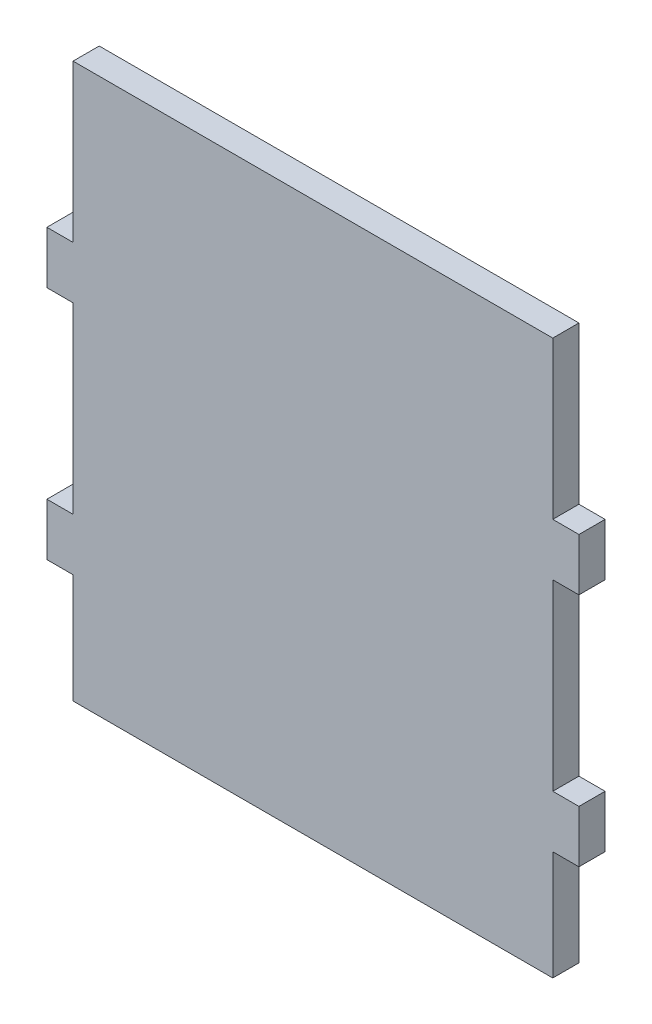
ISO-10303-21;
HEADER;
FILE_DESCRIPTION(('STEP AP214'),'2;1');
FILE_NAME('part.step','',(''),(''),'','','');
FILE_SCHEMA(('AUTOMOTIVE_DESIGN { 1 0 10303 214 1 1 1 1 }'));
ENDSEC;
DATA;
#1=APPLICATION_CONTEXT('core data for automotive mechanical design processes');
#2=APPLICATION_PROTOCOL_DEFINITION('international standard','automotive_design',2000,#1);
#3=PRODUCT_CONTEXT('',#1,'mechanical');
#4=PRODUCT('Part','Part','',(#3));
#5=PRODUCT_RELATED_PRODUCT_CATEGORY('part','',(#4));
#6=PRODUCT_DEFINITION_FORMATION('','',#4);
#7=PRODUCT_DEFINITION_CONTEXT('part definition',#1,'design');
#8=PRODUCT_DEFINITION('design','',#6,#7);
#9=PRODUCT_DEFINITION_SHAPE('','',#8);
#10=(LENGTH_UNIT() NAMED_UNIT(*) SI_UNIT(.MILLI.,.METRE.));
#11=(NAMED_UNIT(*) PLANE_ANGLE_UNIT() SI_UNIT($,.RADIAN.));
#12=(NAMED_UNIT(*) SI_UNIT($,.STERADIAN.) SOLID_ANGLE_UNIT());
#13=UNCERTAINTY_MEASURE_WITH_UNIT(LENGTH_MEASURE(1.E-05),#10,'distance_accuracy_value','');
#14=(GEOMETRIC_REPRESENTATION_CONTEXT(3) GLOBAL_UNCERTAINTY_ASSIGNED_CONTEXT((#13)) GLOBAL_UNIT_ASSIGNED_CONTEXT((#10,
#11,#12)) REPRESENTATION_CONTEXT('',''));
#15=CARTESIAN_POINT('',(0.,0.,0.));
#16=DIRECTION('',(0.,0.,1.));
#17=DIRECTION('',(1.,0.,0.));
#18=AXIS2_PLACEMENT_3D('',#15,#16,#17);
#19=CARTESIAN_POINT('',(0.,-18.,3.));
#20=DIRECTION('',(0.,-1.,0.));
#21=DIRECTION('',(1.,0.,0.));
#22=AXIS2_PLACEMENT_3D('',#19,#20,#21);
#23=PLANE('',#22);
#24=DIRECTION('',(-1.,0.,0.));
#25=VECTOR('',#24,1.);
#26=CARTESIAN_POINT('',(0.,-18.,0.));
#27=LINE('',#26,#25);
#28=CARTESIAN_POINT('',(0.,-18.,0.));
#29=VERTEX_POINT('',#28);
#30=CARTESIAN_POINT('',(-3.,-18.,0.));
#31=VERTEX_POINT('',#30);
#32=EDGE_CURVE('E207',#29,#31,#27,.T.);
#33=ORIENTED_EDGE('',*,*,#32,.T.);
#34=DIRECTION('',(0.,0.,-1.));
#35=VECTOR('',#34,1.);
#36=CARTESIAN_POINT('',(-3.,-18.,3.));
#37=LINE('',#36,#35);
#38=CARTESIAN_POINT('',(-3.,-18.,3.));
#39=VERTEX_POINT('',#38);
#40=EDGE_CURVE('E11',#39,#31,#37,.T.);
#41=ORIENTED_EDGE('',*,*,#40,.F.);
#42=DIRECTION('',(-1.,0.,0.));
#43=VECTOR('',#42,1.);
#44=CARTESIAN_POINT('',(0.,-18.,3.));
#45=LINE('',#44,#43);
#46=CARTESIAN_POINT('',(0.,-18.,3.));
#47=VERTEX_POINT('',#46);
#48=EDGE_CURVE('E245',#47,#39,#45,.T.);
#49=ORIENTED_EDGE('',*,*,#48,.F.);
#50=DIRECTION('',(0.,0.,-1.));
#51=VECTOR('',#50,1.);
#52=CARTESIAN_POINT('',(0.,-18.,3.));
#53=LINE('',#52,#51);
#54=EDGE_CURVE('E203',#47,#29,#53,.T.);
#55=ORIENTED_EDGE('',*,*,#54,.T.);
#56=EDGE_LOOP('',(#33,#41,#49,#55));
#57=FACE_BOUND('',#56,.T.);
#58=ADVANCED_FACE('F39',(#57),#23,.F.);
#59=CARTESIAN_POINT('',(-3.,-18.,3.));
#60=DIRECTION('',(1.,0.,0.));
#61=DIRECTION('',(0.,1.,0.));
#62=AXIS2_PLACEMENT_3D('',#59,#60,#61);
#63=PLANE('',#62);
#64=DIRECTION('',(0.,-1.,0.));
#65=VECTOR('',#64,1.);
#66=CARTESIAN_POINT('',(-3.,-18.,0.));
#67=LINE('',#66,#65);
#68=CARTESIAN_POINT('',(-3.,-24.,0.));
#69=VERTEX_POINT('',#68);
#70=EDGE_CURVE('E210',#31,#69,#67,.T.);
#71=ORIENTED_EDGE('',*,*,#70,.T.);
#72=DIRECTION('',(0.,0.,-1.));
#73=VECTOR('',#72,1.);
#74=CARTESIAN_POINT('',(-3.,-24.,3.));
#75=LINE('',#74,#73);
#76=CARTESIAN_POINT('',(-3.,-24.,3.));
#77=VERTEX_POINT('',#76);
#78=EDGE_CURVE('E47',#77,#69,#75,.T.);
#79=ORIENTED_EDGE('',*,*,#78,.F.);
#80=DIRECTION('',(0.,-1.,0.));
#81=VECTOR('',#80,1.);
#82=CARTESIAN_POINT('',(-3.,-18.,3.));
#83=LINE('',#82,#81);
#84=EDGE_CURVE('E134',#39,#77,#83,.T.);
#85=ORIENTED_EDGE('',*,*,#84,.F.);
#86=ORIENTED_EDGE('',*,*,#40,.T.);
#87=EDGE_LOOP('',(#71,#79,#85,#86));
#88=FACE_BOUND('',#87,.T.);
#89=ADVANCED_FACE('F363',(#88),#63,.F.);
#90=CARTESIAN_POINT('',(0.,-24.,3.));
#91=DIRECTION('',(0.,1.,0.));
#92=DIRECTION('',(0.,0.,1.));
#93=AXIS2_PLACEMENT_3D('',#90,#91,#92);
#94=PLANE('',#93);
#95=DIRECTION('',(1.,0.,0.));
#96=VECTOR('',#95,1.);
#97=CARTESIAN_POINT('',(0.,-24.,0.));
#98=LINE('',#97,#96);
#99=CARTESIAN_POINT('',(0.,-24.,0.));
#100=VERTEX_POINT('',#99);
#101=EDGE_CURVE('E212',#69,#100,#98,.T.);
#102=ORIENTED_EDGE('',*,*,#101,.T.);
#103=DIRECTION('',(0.,0.,-1.));
#104=VECTOR('',#103,1.);
#105=CARTESIAN_POINT('',(0.,-24.,3.));
#106=LINE('',#105,#104);
#107=CARTESIAN_POINT('',(0.,-24.,3.));
#108=VERTEX_POINT('',#107);
#109=EDGE_CURVE('E288',#108,#100,#106,.T.);
#110=ORIENTED_EDGE('',*,*,#109,.F.);
#111=DIRECTION('',(1.,0.,0.));
#112=VECTOR('',#111,1.);
#113=CARTESIAN_POINT('',(0.,-24.,3.));
#114=LINE('',#113,#112);
#115=EDGE_CURVE('E296',#77,#108,#114,.T.);
#116=ORIENTED_EDGE('',*,*,#115,.F.);
#117=ORIENTED_EDGE('',*,*,#78,.T.);
#118=EDGE_LOOP('',(#102,#110,#116,#117));
#119=FACE_BOUND('',#118,.T.);
#120=ADVANCED_FACE('F294',(#119),#94,.F.);
#121=CARTESIAN_POINT('',(0.,-24.,3.));
#122=DIRECTION('',(1.,0.,0.));
#123=DIRECTION('',(0.,1.,0.));
#124=AXIS2_PLACEMENT_3D('',#121,#122,#123);
#125=PLANE('',#124);
#126=DIRECTION('',(0.,-1.,0.));
#127=VECTOR('',#126,1.);
#128=CARTESIAN_POINT('',(0.,-24.,0.));
#129=LINE('',#128,#127);
#130=CARTESIAN_POINT('',(0.,-45.,0.));
#131=VERTEX_POINT('',#130);
#132=EDGE_CURVE('E214',#100,#131,#129,.T.);
#133=ORIENTED_EDGE('',*,*,#132,.T.);
#134=DIRECTION('',(0.,0.,-1.));
#135=VECTOR('',#134,1.);
#136=CARTESIAN_POINT('',(0.,-45.,3.));
#137=LINE('',#136,#135);
#138=CARTESIAN_POINT('',(0.,-45.,3.));
#139=VERTEX_POINT('',#138);
#140=EDGE_CURVE('E285',#139,#131,#137,.T.);
#141=ORIENTED_EDGE('',*,*,#140,.F.);
#142=DIRECTION('',(0.,-1.,0.));
#143=VECTOR('',#142,1.);
#144=CARTESIAN_POINT('',(0.,-24.,3.));
#145=LINE('',#144,#143);
#146=EDGE_CURVE('E314',#108,#139,#145,.T.);
#147=ORIENTED_EDGE('',*,*,#146,.F.);
#148=ORIENTED_EDGE('',*,*,#109,.T.);
#149=EDGE_LOOP('',(#133,#141,#147,#148));
#150=FACE_BOUND('',#149,.T.);
#151=ADVANCED_FACE('F305',(#150),#125,.F.);
#152=CARTESIAN_POINT('',(0.,-45.,3.));
#153=DIRECTION('',(0.,-1.,0.));
#154=DIRECTION('',(1.,0.,0.));
#155=AXIS2_PLACEMENT_3D('',#152,#153,#154);
#156=PLANE('',#155);
#157=DIRECTION('',(-1.,0.,0.));
#158=VECTOR('',#157,1.);
#159=CARTESIAN_POINT('',(0.,-45.,0.));
#160=LINE('',#159,#158);
#161=CARTESIAN_POINT('',(-3.,-45.,0.));
#162=VERTEX_POINT('',#161);
#163=EDGE_CURVE('E216',#131,#162,#160,.T.);
#164=ORIENTED_EDGE('',*,*,#163,.T.);
#165=DIRECTION('',(0.,0.,-1.));
#166=VECTOR('',#165,1.);
#167=CARTESIAN_POINT('',(-3.,-45.,3.));
#168=LINE('',#167,#166);
#169=CARTESIAN_POINT('',(-3.,-45.,3.));
#170=VERTEX_POINT('',#169);
#171=EDGE_CURVE('E282',#170,#162,#168,.T.);
#172=ORIENTED_EDGE('',*,*,#171,.F.);
#173=DIRECTION('',(-1.,0.,0.));
#174=VECTOR('',#173,1.);
#175=CARTESIAN_POINT('',(0.,-45.,3.));
#176=LINE('',#175,#174);
#177=EDGE_CURVE('E311',#139,#170,#176,.T.);
#178=ORIENTED_EDGE('',*,*,#177,.F.);
#179=ORIENTED_EDGE('',*,*,#140,.T.);
#180=EDGE_LOOP('',(#164,#172,#178,#179));
#181=FACE_BOUND('',#180,.T.);
#182=ADVANCED_FACE('F309',(#181),#156,.F.);
#183=CARTESIAN_POINT('',(-3.,-45.,3.));
#184=DIRECTION('',(1.,0.,0.));
#185=DIRECTION('',(0.,1.,0.));
#186=AXIS2_PLACEMENT_3D('',#183,#184,#185);
#187=PLANE('',#186);
#188=DIRECTION('',(0.,-1.,0.));
#189=VECTOR('',#188,1.);
#190=CARTESIAN_POINT('',(-3.,-45.,0.));
#191=LINE('',#190,#189);
#192=CARTESIAN_POINT('',(-3.,-51.,0.));
#193=VERTEX_POINT('',#192);
#194=EDGE_CURVE('E218',#162,#193,#191,.T.);
#195=ORIENTED_EDGE('',*,*,#194,.T.);
#196=DIRECTION('',(0.,0.,-1.));
#197=VECTOR('',#196,1.);
#198=CARTESIAN_POINT('',(-3.,-51.,3.));
#199=LINE('',#198,#197);
#200=CARTESIAN_POINT('',(-3.,-51.,3.));
#201=VERTEX_POINT('',#200);
#202=EDGE_CURVE('E279',#201,#193,#199,.T.);
#203=ORIENTED_EDGE('',*,*,#202,.F.);
#204=DIRECTION('',(0.,-1.,0.));
#205=VECTOR('',#204,1.);
#206=CARTESIAN_POINT('',(-3.,-45.,3.));
#207=LINE('',#206,#205);
#208=EDGE_CURVE('E313',#170,#201,#207,.T.);
#209=ORIENTED_EDGE('',*,*,#208,.F.);
#210=ORIENTED_EDGE('',*,*,#171,.T.);
#211=EDGE_LOOP('',(#195,#203,#209,#210));
#212=FACE_BOUND('',#211,.T.);
#213=ADVANCED_FACE('F376',(#212),#187,.F.);
#214=CARTESIAN_POINT('',(0.,-51.,3.));
#215=DIRECTION('',(0.,1.,0.));
#216=DIRECTION('',(0.,0.,1.));
#217=AXIS2_PLACEMENT_3D('',#214,#215,#216);
#218=PLANE('',#217);
#219=DIRECTION('',(1.,0.,0.));
#220=VECTOR('',#219,1.);
#221=CARTESIAN_POINT('',(0.,-51.,0.));
#222=LINE('',#221,#220);
#223=CARTESIAN_POINT('',(0.,-51.,0.));
#224=VERTEX_POINT('',#223);
#225=EDGE_CURVE('E220',#193,#224,#222,.T.);
#226=ORIENTED_EDGE('',*,*,#225,.T.);
#227=DIRECTION('',(0.,0.,-1.));
#228=VECTOR('',#227,1.);
#229=CARTESIAN_POINT('',(0.,-51.,3.));
#230=LINE('',#229,#228);
#231=CARTESIAN_POINT('',(0.,-51.,3.));
#232=VERTEX_POINT('',#231);
#233=EDGE_CURVE('E276',#232,#224,#230,.T.);
#234=ORIENTED_EDGE('',*,*,#233,.F.);
#235=DIRECTION('',(1.,0.,0.));
#236=VECTOR('',#235,1.);
#237=CARTESIAN_POINT('',(0.,-51.,3.));
#238=LINE('',#237,#236);
#239=EDGE_CURVE('E316',#201,#232,#238,.T.);
#240=ORIENTED_EDGE('',*,*,#239,.F.);
#241=ORIENTED_EDGE('',*,*,#202,.T.);
#242=EDGE_LOOP('',(#226,#234,#240,#241));
#243=FACE_BOUND('',#242,.T.);
#244=ADVANCED_FACE('F379',(#243),#218,.F.);
#245=CARTESIAN_POINT('',(0.,-51.,3.));
#246=DIRECTION('',(1.,0.,0.));
#247=DIRECTION('',(0.,1.,0.));
#248=AXIS2_PLACEMENT_3D('',#245,#246,#247);
#249=PLANE('',#248);
#250=DIRECTION('',(0.,-1.,0.));
#251=VECTOR('',#250,1.);
#252=CARTESIAN_POINT('',(0.,-51.,0.));
#253=LINE('',#252,#251);
#254=CARTESIAN_POINT('',(0.,-63.54,0.));
#255=VERTEX_POINT('',#254);
#256=EDGE_CURVE('E222',#224,#255,#253,.T.);
#257=ORIENTED_EDGE('',*,*,#256,.T.);
#258=DIRECTION('',(0.,0.,-1.));
#259=VECTOR('',#258,1.);
#260=CARTESIAN_POINT('',(0.,-63.54,3.));
#261=LINE('',#260,#259);
#262=CARTESIAN_POINT('',(0.,-63.54,3.));
#263=VERTEX_POINT('',#262);
#264=EDGE_CURVE('E273',#263,#255,#261,.T.);
#265=ORIENTED_EDGE('',*,*,#264,.F.);
#266=DIRECTION('',(0.,-1.,0.));
#267=VECTOR('',#266,1.);
#268=CARTESIAN_POINT('',(0.,-51.,3.));
#269=LINE('',#268,#267);
#270=EDGE_CURVE('E322',#232,#263,#269,.T.);
#271=ORIENTED_EDGE('',*,*,#270,.F.);
#272=ORIENTED_EDGE('',*,*,#233,.T.);
#273=EDGE_LOOP('',(#257,#265,#271,#272));
#274=FACE_BOUND('',#273,.T.);
#275=ADVANCED_FACE('F383',(#274),#249,.F.);
#276=CARTESIAN_POINT('',(0.,-63.54,3.));
#277=DIRECTION('',(0.,1.,0.));
#278=DIRECTION('',(-1.,0.,0.));
#279=AXIS2_PLACEMENT_3D('',#276,#277,#278);
#280=PLANE('',#279);
#281=DIRECTION('',(1.,0.,0.));
#282=VECTOR('',#281,1.);
#283=CARTESIAN_POINT('',(0.,-63.54,0.));
#284=LINE('',#283,#282);
#285=CARTESIAN_POINT('',(55.,-63.54,0.));
#286=VERTEX_POINT('',#285);
#287=EDGE_CURVE('E224',#255,#286,#284,.T.);
#288=ORIENTED_EDGE('',*,*,#287,.T.);
#289=DIRECTION('',(0.,0.,-1.));
#290=VECTOR('',#289,1.);
#291=CARTESIAN_POINT('',(55.,-63.54,3.));
#292=LINE('',#291,#290);
#293=CARTESIAN_POINT('',(55.,-63.54,3.));
#294=VERTEX_POINT('',#293);
#295=EDGE_CURVE('E270',#294,#286,#292,.T.);
#296=ORIENTED_EDGE('',*,*,#295,.F.);
#297=DIRECTION('',(1.,0.,0.));
#298=VECTOR('',#297,1.);
#299=CARTESIAN_POINT('',(0.,-63.54,3.));
#300=LINE('',#299,#298);
#301=EDGE_CURVE('E324',#263,#294,#300,.T.);
#302=ORIENTED_EDGE('',*,*,#301,.F.);
#303=ORIENTED_EDGE('',*,*,#264,.T.);
#304=EDGE_LOOP('',(#288,#296,#302,#303));
#305=FACE_BOUND('',#304,.T.);
#306=ADVANCED_FACE('F387',(#305),#280,.F.);
#307=CARTESIAN_POINT('',(55.,-51.,3.));
#308=DIRECTION('',(-1.,0.,0.));
#309=DIRECTION('',(0.,-1.,0.));
#310=AXIS2_PLACEMENT_3D('',#307,#308,#309);
#311=PLANE('',#310);
#312=DIRECTION('',(0.,1.,0.));
#313=VECTOR('',#312,1.);
#314=CARTESIAN_POINT('',(55.,-51.,0.));
#315=LINE('',#314,#313);
#316=CARTESIAN_POINT('',(55.,-51.,0.));
#317=VERTEX_POINT('',#316);
#318=EDGE_CURVE('E226',#286,#317,#315,.T.);
#319=ORIENTED_EDGE('',*,*,#318,.T.);
#320=DIRECTION('',(0.,0.,-1.));
#321=VECTOR('',#320,1.);
#322=CARTESIAN_POINT('',(55.,-51.,3.));
#323=LINE('',#322,#321);
#324=CARTESIAN_POINT('',(55.,-51.,3.));
#325=VERTEX_POINT('',#324);
#326=EDGE_CURVE('E267',#325,#317,#323,.T.);
#327=ORIENTED_EDGE('',*,*,#326,.F.);
#328=DIRECTION('',(0.,1.,0.));
#329=VECTOR('',#328,1.);
#330=CARTESIAN_POINT('',(55.,-51.,3.));
#331=LINE('',#330,#329);
#332=EDGE_CURVE('E326',#294,#325,#331,.T.);
#333=ORIENTED_EDGE('',*,*,#332,.F.);
#334=ORIENTED_EDGE('',*,*,#295,.T.);
#335=EDGE_LOOP('',(#319,#327,#333,#334));
#336=FACE_BOUND('',#335,.T.);
#337=ADVANCED_FACE('F391',(#336),#311,.F.);
#338=CARTESIAN_POINT('',(55.,-51.,3.));
#339=DIRECTION('',(0.,1.,0.));
#340=DIRECTION('',(0.,0.,1.));
#341=AXIS2_PLACEMENT_3D('',#338,#339,#340);
#342=PLANE('',#341);
#343=DIRECTION('',(1.,0.,0.));
#344=VECTOR('',#343,1.);
#345=CARTESIAN_POINT('',(55.,-51.,0.));
#346=LINE('',#345,#344);
#347=CARTESIAN_POINT('',(58.,-51.,0.));
#348=VERTEX_POINT('',#347);
#349=EDGE_CURVE('E228',#317,#348,#346,.T.);
#350=ORIENTED_EDGE('',*,*,#349,.T.);
#351=DIRECTION('',(0.,0.,-1.));
#352=VECTOR('',#351,1.);
#353=CARTESIAN_POINT('',(58.,-51.,3.));
#354=LINE('',#353,#352);
#355=CARTESIAN_POINT('',(58.,-51.,3.));
#356=VERTEX_POINT('',#355);
#357=EDGE_CURVE('E264',#356,#348,#354,.T.);
#358=ORIENTED_EDGE('',*,*,#357,.F.);
#359=DIRECTION('',(1.,0.,0.));
#360=VECTOR('',#359,1.);
#361=CARTESIAN_POINT('',(55.,-51.,3.));
#362=LINE('',#361,#360);
#363=EDGE_CURVE('E328',#325,#356,#362,.T.);
#364=ORIENTED_EDGE('',*,*,#363,.F.);
#365=ORIENTED_EDGE('',*,*,#326,.T.);
#366=EDGE_LOOP('',(#350,#358,#364,#365));
#367=FACE_BOUND('',#366,.T.);
#368=ADVANCED_FACE('F395',(#367),#342,.F.);
#369=CARTESIAN_POINT('',(58.,-45.,3.));
#370=DIRECTION('',(-1.,0.,0.));
#371=DIRECTION('',(0.,-1.,0.));
#372=AXIS2_PLACEMENT_3D('',#369,#370,#371);
#373=PLANE('',#372);
#374=DIRECTION('',(0.,1.,0.));
#375=VECTOR('',#374,1.);
#376=CARTESIAN_POINT('',(58.,-45.,0.));
#377=LINE('',#376,#375);
#378=CARTESIAN_POINT('',(58.,-45.,0.));
#379=VERTEX_POINT('',#378);
#380=EDGE_CURVE('E230',#348,#379,#377,.T.);
#381=ORIENTED_EDGE('',*,*,#380,.T.);
#382=DIRECTION('',(0.,0.,-1.));
#383=VECTOR('',#382,1.);
#384=CARTESIAN_POINT('',(58.,-45.,3.));
#385=LINE('',#384,#383);
#386=CARTESIAN_POINT('',(58.,-45.,3.));
#387=VERTEX_POINT('',#386);
#388=EDGE_CURVE('E261',#387,#379,#385,.T.);
#389=ORIENTED_EDGE('',*,*,#388,.F.);
#390=DIRECTION('',(0.,1.,0.));
#391=VECTOR('',#390,1.);
#392=CARTESIAN_POINT('',(58.,-45.,3.));
#393=LINE('',#392,#391);
#394=EDGE_CURVE('E330',#356,#387,#393,.T.);
#395=ORIENTED_EDGE('',*,*,#394,.F.);
#396=ORIENTED_EDGE('',*,*,#357,.T.);
#397=EDGE_LOOP('',(#381,#389,#395,#396));
#398=FACE_BOUND('',#397,.T.);
#399=ADVANCED_FACE('F399',(#398),#373,.F.);
#400=CARTESIAN_POINT('',(55.,-45.,3.));
#401=DIRECTION('',(0.,-1.,0.));
#402=DIRECTION('',(0.,0.,-1.));
#403=AXIS2_PLACEMENT_3D('',#400,#401,#402);
#404=PLANE('',#403);
#405=DIRECTION('',(-1.,0.,0.));
#406=VECTOR('',#405,1.);
#407=CARTESIAN_POINT('',(55.,-45.,0.));
#408=LINE('',#407,#406);
#409=CARTESIAN_POINT('',(55.,-45.,0.));
#410=VERTEX_POINT('',#409);
#411=EDGE_CURVE('E232',#379,#410,#408,.T.);
#412=ORIENTED_EDGE('',*,*,#411,.T.);
#413=DIRECTION('',(0.,0.,-1.));
#414=VECTOR('',#413,1.);
#415=CARTESIAN_POINT('',(55.,-45.,3.));
#416=LINE('',#415,#414);
#417=CARTESIAN_POINT('',(55.,-45.,3.));
#418=VERTEX_POINT('',#417);
#419=EDGE_CURVE('E258',#418,#410,#416,.T.);
#420=ORIENTED_EDGE('',*,*,#419,.F.);
#421=DIRECTION('',(-1.,0.,0.));
#422=VECTOR('',#421,1.);
#423=CARTESIAN_POINT('',(55.,-45.,3.));
#424=LINE('',#423,#422);
#425=EDGE_CURVE('E332',#387,#418,#424,.T.);
#426=ORIENTED_EDGE('',*,*,#425,.F.);
#427=ORIENTED_EDGE('',*,*,#388,.T.);
#428=EDGE_LOOP('',(#412,#420,#426,#427));
#429=FACE_BOUND('',#428,.T.);
#430=ADVANCED_FACE('F403',(#429),#404,.F.);
#431=CARTESIAN_POINT('',(55.,-24.,3.));
#432=DIRECTION('',(-1.,0.,0.));
#433=DIRECTION('',(0.,-1.,0.));
#434=AXIS2_PLACEMENT_3D('',#431,#432,#433);
#435=PLANE('',#434);
#436=DIRECTION('',(0.,1.,0.));
#437=VECTOR('',#436,1.);
#438=CARTESIAN_POINT('',(55.,-24.,0.));
#439=LINE('',#438,#437);
#440=CARTESIAN_POINT('',(55.,-24.,0.));
#441=VERTEX_POINT('',#440);
#442=EDGE_CURVE('E234',#410,#441,#439,.T.);
#443=ORIENTED_EDGE('',*,*,#442,.T.);
#444=DIRECTION('',(0.,0.,-1.));
#445=VECTOR('',#444,1.);
#446=CARTESIAN_POINT('',(55.,-24.,3.));
#447=LINE('',#446,#445);
#448=CARTESIAN_POINT('',(55.,-24.,3.));
#449=VERTEX_POINT('',#448);
#450=EDGE_CURVE('E255',#449,#441,#447,.T.);
#451=ORIENTED_EDGE('',*,*,#450,.F.);
#452=DIRECTION('',(0.,1.,0.));
#453=VECTOR('',#452,1.);
#454=CARTESIAN_POINT('',(55.,-24.,3.));
#455=LINE('',#454,#453);
#456=EDGE_CURVE('E334',#418,#449,#455,.T.);
#457=ORIENTED_EDGE('',*,*,#456,.F.);
#458=ORIENTED_EDGE('',*,*,#419,.T.);
#459=EDGE_LOOP('',(#443,#451,#457,#458));
#460=FACE_BOUND('',#459,.T.);
#461=ADVANCED_FACE('F407',(#460),#435,.F.);
#462=CARTESIAN_POINT('',(55.,-24.,3.));
#463=DIRECTION('',(0.,1.,0.));
#464=DIRECTION('',(0.,0.,1.));
#465=AXIS2_PLACEMENT_3D('',#462,#463,#464);
#466=PLANE('',#465);
#467=DIRECTION('',(1.,0.,0.));
#468=VECTOR('',#467,1.);
#469=CARTESIAN_POINT('',(55.,-24.,0.));
#470=LINE('',#469,#468);
#471=CARTESIAN_POINT('',(58.,-24.,0.));
#472=VERTEX_POINT('',#471);
#473=EDGE_CURVE('E236',#441,#472,#470,.T.);
#474=ORIENTED_EDGE('',*,*,#473,.T.);
#475=DIRECTION('',(0.,0.,-1.));
#476=VECTOR('',#475,1.);
#477=CARTESIAN_POINT('',(58.,-24.,3.));
#478=LINE('',#477,#476);
#479=CARTESIAN_POINT('',(58.,-24.,3.));
#480=VERTEX_POINT('',#479);
#481=EDGE_CURVE('E252',#480,#472,#478,.T.);
#482=ORIENTED_EDGE('',*,*,#481,.F.);
#483=DIRECTION('',(1.,0.,0.));
#484=VECTOR('',#483,1.);
#485=CARTESIAN_POINT('',(55.,-24.,3.));
#486=LINE('',#485,#484);
#487=EDGE_CURVE('E336',#449,#480,#486,.T.);
#488=ORIENTED_EDGE('',*,*,#487,.F.);
#489=ORIENTED_EDGE('',*,*,#450,.T.);
#490=EDGE_LOOP('',(#474,#482,#488,#489));
#491=FACE_BOUND('',#490,.T.);
#492=ADVANCED_FACE('F411',(#491),#466,.F.);
#493=CARTESIAN_POINT('',(58.,-18.,3.));
#494=DIRECTION('',(-1.,0.,0.));
#495=DIRECTION('',(0.,0.,1.));
#496=AXIS2_PLACEMENT_3D('',#493,#494,#495);
#497=PLANE('',#496);
#498=DIRECTION('',(0.,1.,0.));
#499=VECTOR('',#498,1.);
#500=CARTESIAN_POINT('',(58.,-18.,0.));
#501=LINE('',#500,#499);
#502=CARTESIAN_POINT('',(58.,-18.,0.));
#503=VERTEX_POINT('',#502);
#504=EDGE_CURVE('E238',#472,#503,#501,.T.);
#505=ORIENTED_EDGE('',*,*,#504,.T.);
#506=DIRECTION('',(0.,0.,-1.));
#507=VECTOR('',#506,1.);
#508=CARTESIAN_POINT('',(58.,-18.,3.));
#509=LINE('',#508,#507);
#510=CARTESIAN_POINT('',(58.,-18.,3.));
#511=VERTEX_POINT('',#510);
#512=EDGE_CURVE('E249',#511,#503,#509,.T.);
#513=ORIENTED_EDGE('',*,*,#512,.F.);
#514=DIRECTION('',(0.,1.,0.));
#515=VECTOR('',#514,1.);
#516=CARTESIAN_POINT('',(58.,-18.,3.));
#517=LINE('',#516,#515);
#518=EDGE_CURVE('E338',#480,#511,#517,.T.);
#519=ORIENTED_EDGE('',*,*,#518,.F.);
#520=ORIENTED_EDGE('',*,*,#481,.T.);
#521=EDGE_LOOP('',(#505,#513,#519,#520));
#522=FACE_BOUND('',#521,.T.);
#523=ADVANCED_FACE('F344',(#522),#497,.F.);
#524=CARTESIAN_POINT('',(55.,-18.,3.));
#525=DIRECTION('',(0.,-1.,0.));
#526=DIRECTION('',(0.,0.,-1.));
#527=AXIS2_PLACEMENT_3D('',#524,#525,#526);
#528=PLANE('',#527);
#529=DIRECTION('',(-1.,0.,0.));
#530=VECTOR('',#529,1.);
#531=CARTESIAN_POINT('',(55.,-18.,0.));
#532=LINE('',#531,#530);
#533=CARTESIAN_POINT('',(55.,-18.,0.));
#534=VERTEX_POINT('',#533);
#535=EDGE_CURVE('E240',#503,#534,#532,.T.);
#536=ORIENTED_EDGE('',*,*,#535,.T.);
#537=DIRECTION('',(0.,0.,-1.));
#538=VECTOR('',#537,1.);
#539=CARTESIAN_POINT('',(55.,-18.,3.));
#540=LINE('',#539,#538);
#541=CARTESIAN_POINT('',(55.,-18.,3.));
#542=VERTEX_POINT('',#541);
#543=EDGE_CURVE('E198',#542,#534,#540,.T.);
#544=ORIENTED_EDGE('',*,*,#543,.F.);
#545=DIRECTION('',(-1.,0.,0.));
#546=VECTOR('',#545,1.);
#547=CARTESIAN_POINT('',(55.,-18.,3.));
#548=LINE('',#547,#546);
#549=EDGE_CURVE('E189',#511,#542,#548,.T.);
#550=ORIENTED_EDGE('',*,*,#549,.F.);
#551=ORIENTED_EDGE('',*,*,#512,.T.);
#552=EDGE_LOOP('',(#536,#544,#550,#551));
#553=FACE_BOUND('',#552,.T.);
#554=ADVANCED_FACE('F348',(#553),#528,.F.);
#555=CARTESIAN_POINT('',(55.,0.,3.));
#556=DIRECTION('',(-1.,0.,0.));
#557=DIRECTION('',(0.,0.,1.));
#558=AXIS2_PLACEMENT_3D('',#555,#556,#557);
#559=PLANE('',#558);
#560=DIRECTION('',(0.,1.,0.));
#561=VECTOR('',#560,1.);
#562=CARTESIAN_POINT('',(55.,0.,0.));
#563=LINE('',#562,#561);
#564=CARTESIAN_POINT('',(55.,0.,0.));
#565=VERTEX_POINT('',#564);
#566=EDGE_CURVE('E197',#534,#565,#563,.T.);
#567=ORIENTED_EDGE('',*,*,#566,.T.);
#568=DIRECTION('',(0.,0.,-1.));
#569=VECTOR('',#568,1.);
#570=CARTESIAN_POINT('',(55.,0.,3.));
#571=LINE('',#570,#569);
#572=CARTESIAN_POINT('',(55.,0.,3.));
#573=VERTEX_POINT('',#572);
#574=EDGE_CURVE('E194',#573,#565,#571,.T.);
#575=ORIENTED_EDGE('',*,*,#574,.F.);
#576=DIRECTION('',(0.,1.,0.));
#577=VECTOR('',#576,1.);
#578=CARTESIAN_POINT('',(55.,0.,3.));
#579=LINE('',#578,#577);
#580=EDGE_CURVE('E183',#542,#573,#579,.T.);
#581=ORIENTED_EDGE('',*,*,#580,.F.);
#582=ORIENTED_EDGE('',*,*,#543,.T.);
#583=EDGE_LOOP('',(#567,#575,#581,#582));
#584=FACE_BOUND('',#583,.T.);
#585=ADVANCED_FACE('F195',(#584),#559,.F.);
#586=CARTESIAN_POINT('',(0.,0.,3.));
#587=DIRECTION('',(0.,-1.,0.));
#588=DIRECTION('',(0.,0.,-1.));
#589=AXIS2_PLACEMENT_3D('',#586,#587,#588);
#590=PLANE('',#589);
#591=DIRECTION('',(-1.,0.,0.));
#592=VECTOR('',#591,1.);
#593=CARTESIAN_POINT('',(0.,0.,0.));
#594=LINE('',#593,#592);
#595=CARTESIAN_POINT('',(0.,0.,0.));
#596=VERTEX_POINT('',#595);
#597=EDGE_CURVE('E120',#565,#596,#594,.T.);
#598=ORIENTED_EDGE('',*,*,#597,.T.);
#599=DIRECTION('',(0.,0.,-1.));
#600=VECTOR('',#599,1.);
#601=CARTESIAN_POINT('',(0.,0.,3.));
#602=LINE('',#601,#600);
#603=CARTESIAN_POINT('',(0.,0.,3.));
#604=VERTEX_POINT('',#603);
#605=EDGE_CURVE('E199',#604,#596,#602,.T.);
#606=ORIENTED_EDGE('',*,*,#605,.F.);
#607=DIRECTION('',(-1.,0.,0.));
#608=VECTOR('',#607,1.);
#609=CARTESIAN_POINT('',(0.,0.,3.));
#610=LINE('',#609,#608);
#611=EDGE_CURVE('E187',#573,#604,#610,.T.);
#612=ORIENTED_EDGE('',*,*,#611,.F.);
#613=ORIENTED_EDGE('',*,*,#574,.T.);
#614=EDGE_LOOP('',(#598,#606,#612,#613));
#615=FACE_BOUND('',#614,.T.);
#616=ADVANCED_FACE('F201',(#615),#590,.F.);
#617=CARTESIAN_POINT('',(0.,0.,3.));
#618=DIRECTION('',(1.,0.,0.));
#619=DIRECTION('',(0.,1.,0.));
#620=AXIS2_PLACEMENT_3D('',#617,#618,#619);
#621=PLANE('',#620);
#622=DIRECTION('',(0.,-1.,0.));
#623=VECTOR('',#622,1.);
#624=CARTESIAN_POINT('',(0.,0.,0.));
#625=LINE('',#624,#623);
#626=EDGE_CURVE('E126',#596,#29,#625,.T.);
#627=ORIENTED_EDGE('',*,*,#626,.T.);
#628=ORIENTED_EDGE('',*,*,#54,.F.);
#629=DIRECTION('',(0.,-1.,0.));
#630=VECTOR('',#629,1.);
#631=CARTESIAN_POINT('',(0.,0.,3.));
#632=LINE('',#631,#630);
#633=EDGE_CURVE('E55',#604,#47,#632,.T.);
#634=ORIENTED_EDGE('',*,*,#633,.F.);
#635=ORIENTED_EDGE('',*,*,#605,.T.);
#636=EDGE_LOOP('',(#627,#628,#634,#635));
#637=FACE_BOUND('',#636,.T.);
#638=ADVANCED_FACE('F352',(#637),#621,.F.);
#639=CARTESIAN_POINT('',(0.,0.,3.));
#640=DIRECTION('',(0.,0.,1.));
#641=DIRECTION('',(1.,0.,0.));
#642=AXIS2_PLACEMENT_3D('',#639,#640,#641);
#643=PLANE('',#642);
#644=ORIENTED_EDGE('',*,*,#48,.T.);
#645=ORIENTED_EDGE('',*,*,#84,.T.);
#646=ORIENTED_EDGE('',*,*,#115,.T.);
#647=ORIENTED_EDGE('',*,*,#146,.T.);
#648=ORIENTED_EDGE('',*,*,#177,.T.);
#649=ORIENTED_EDGE('',*,*,#208,.T.);
#650=ORIENTED_EDGE('',*,*,#239,.T.);
#651=ORIENTED_EDGE('',*,*,#270,.T.);
#652=ORIENTED_EDGE('',*,*,#301,.T.);
#653=ORIENTED_EDGE('',*,*,#332,.T.);
#654=ORIENTED_EDGE('',*,*,#363,.T.);
#655=ORIENTED_EDGE('',*,*,#394,.T.);
#656=ORIENTED_EDGE('',*,*,#425,.T.);
#657=ORIENTED_EDGE('',*,*,#456,.T.);
#658=ORIENTED_EDGE('',*,*,#487,.T.);
#659=ORIENTED_EDGE('',*,*,#518,.T.);
#660=ORIENTED_EDGE('',*,*,#549,.T.);
#661=ORIENTED_EDGE('',*,*,#580,.T.);
#662=ORIENTED_EDGE('',*,*,#611,.T.);
#663=ORIENTED_EDGE('',*,*,#633,.T.);
#664=EDGE_LOOP('',(#644,#645,#646,#647,#648,#649,#650,#651,#652,#653,#654,#655,#656,#657,#658,
#659,#660,#661,#662,#663));
#665=FACE_BOUND('',#664,.T.);
#666=ADVANCED_FACE('F185',(#665),#643,.T.);
#667=CARTESIAN_POINT('',(0.,0.,0.));
#668=DIRECTION('',(0.,0.,1.));
#669=DIRECTION('',(1.,0.,0.));
#670=AXIS2_PLACEMENT_3D('',#667,#668,#669);
#671=PLANE('',#670);
#672=ORIENTED_EDGE('',*,*,#32,.F.);
#673=ORIENTED_EDGE('',*,*,#626,.F.);
#674=ORIENTED_EDGE('',*,*,#597,.F.);
#675=ORIENTED_EDGE('',*,*,#566,.F.);
#676=ORIENTED_EDGE('',*,*,#535,.F.);
#677=ORIENTED_EDGE('',*,*,#504,.F.);
#678=ORIENTED_EDGE('',*,*,#473,.F.);
#679=ORIENTED_EDGE('',*,*,#442,.F.);
#680=ORIENTED_EDGE('',*,*,#411,.F.);
#681=ORIENTED_EDGE('',*,*,#380,.F.);
#682=ORIENTED_EDGE('',*,*,#349,.F.);
#683=ORIENTED_EDGE('',*,*,#318,.F.);
#684=ORIENTED_EDGE('',*,*,#287,.F.);
#685=ORIENTED_EDGE('',*,*,#256,.F.);
#686=ORIENTED_EDGE('',*,*,#225,.F.);
#687=ORIENTED_EDGE('',*,*,#194,.F.);
#688=ORIENTED_EDGE('',*,*,#163,.F.);
#689=ORIENTED_EDGE('',*,*,#132,.F.);
#690=ORIENTED_EDGE('',*,*,#101,.F.);
#691=ORIENTED_EDGE('',*,*,#70,.F.);
#692=EDGE_LOOP('',(#672,#673,#674,#675,#676,#677,#678,#679,#680,#681,#682,#683,#684,#685,#686,
#687,#688,#689,#690,#691));
#693=FACE_BOUND('',#692,.T.);
#694=ADVANCED_FACE('F300',(#693),#671,.F.);
#695=CLOSED_SHELL('',(#58,#89,#120,#151,#182,#213,#244,#275,#306,#337,#368,#399,#430,#461,#492,
#523,#554,#585,#616,#638,#666,#694));
#696=MANIFOLD_SOLID_BREP('B2',#695);
#697=ADVANCED_BREP_SHAPE_REPRESENTATION('',(#18,#696),#14);
#698=SHAPE_DEFINITION_REPRESENTATION(#9,#697);
ENDSEC;
END-ISO-10303-21;
